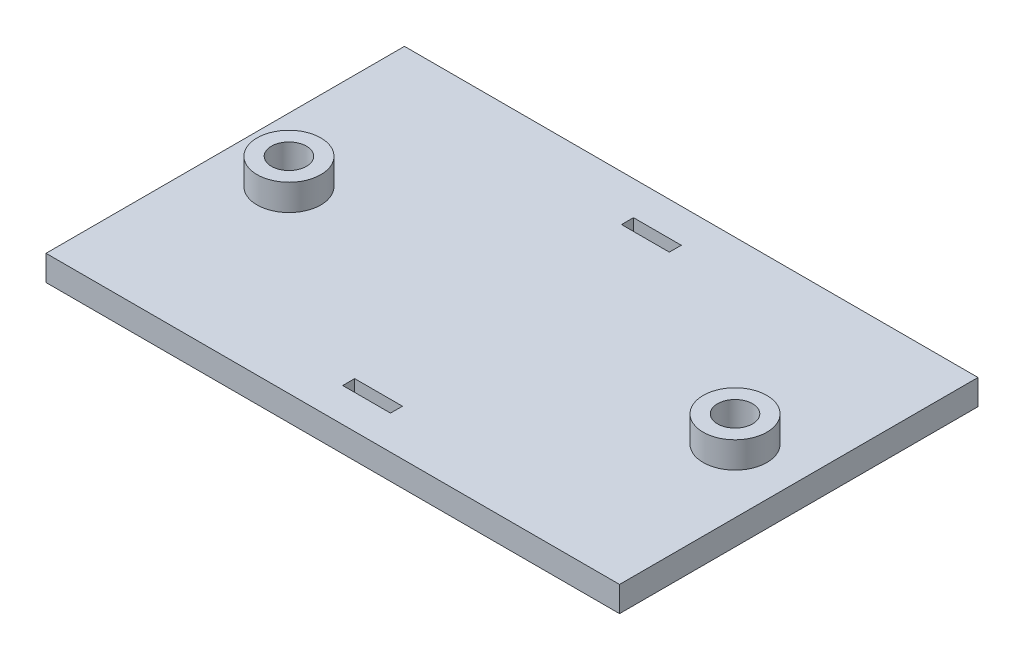
ISO-10303-21;
HEADER;
FILE_DESCRIPTION(('STEP AP214'),'2;1');
FILE_NAME('part.step','',(''),(''),'','','');
FILE_SCHEMA(('AUTOMOTIVE_DESIGN { 1 0 10303 214 1 1 1 1 }'));
ENDSEC;
DATA;
#1=APPLICATION_CONTEXT('core data for automotive mechanical design processes');
#2=APPLICATION_PROTOCOL_DEFINITION('international standard','automotive_design',2000,#1);
#3=PRODUCT_CONTEXT('',#1,'mechanical');
#4=PRODUCT('Part','Part','',(#3));
#5=PRODUCT_RELATED_PRODUCT_CATEGORY('part','',(#4));
#6=PRODUCT_DEFINITION_FORMATION('','',#4);
#7=PRODUCT_DEFINITION_CONTEXT('part definition',#1,'design');
#8=PRODUCT_DEFINITION('design','',#6,#7);
#9=PRODUCT_DEFINITION_SHAPE('','',#8);
#10=(LENGTH_UNIT() NAMED_UNIT(*) SI_UNIT(.MILLI.,.METRE.));
#11=(NAMED_UNIT(*) PLANE_ANGLE_UNIT() SI_UNIT($,.RADIAN.));
#12=(NAMED_UNIT(*) SI_UNIT($,.STERADIAN.) SOLID_ANGLE_UNIT());
#13=UNCERTAINTY_MEASURE_WITH_UNIT(LENGTH_MEASURE(1.E-05),#10,'distance_accuracy_value','');
#14=(GEOMETRIC_REPRESENTATION_CONTEXT(3) GLOBAL_UNCERTAINTY_ASSIGNED_CONTEXT((#13)) GLOBAL_UNIT_ASSIGNED_CONTEXT((#10,
#11,#12)) REPRESENTATION_CONTEXT('',''));
#15=CARTESIAN_POINT('',(0.,0.,0.));
#16=DIRECTION('',(0.,0.,1.));
#17=DIRECTION('',(1.,0.,0.));
#18=AXIS2_PLACEMENT_3D('',#15,#16,#17);
#19=CARTESIAN_POINT('',(0.,95.75,0.));
#20=DIRECTION('',(0.,-1.,0.));
#21=DIRECTION('',(0.,0.,-1.));
#22=AXIS2_PLACEMENT_3D('',#19,#20,#21);
#23=PLANE('',#22);
#24=CARTESIAN_POINT('',(-28.,95.75,0.));
#25=DIRECTION('',(0.,1.,0.));
#26=DIRECTION('',(0.,0.,1.));
#27=AXIS2_PLACEMENT_3D('',#24,#25,#26);
#28=CIRCLE('',#27,4.);
#29=CARTESIAN_POINT('',(-28.,95.75,-4.));
#30=VERTEX_POINT('',#29);
#31=EDGE_CURVE('E11',#30,#30,#28,.T.);
#32=ORIENTED_EDGE('',*,*,#31,.F.);
#33=EDGE_LOOP('',(#32));
#34=FACE_BOUND('',#33,.T.);
#35=CARTESIAN_POINT('',(28.,95.75,0.));
#36=DIRECTION('',(0.,1.,0.));
#37=DIRECTION('',(0.,0.,1.));
#38=AXIS2_PLACEMENT_3D('',#35,#36,#37);
#39=CIRCLE('',#38,4.);
#40=CARTESIAN_POINT('',(28.,95.75,-4.));
#41=VERTEX_POINT('',#40);
#42=EDGE_CURVE('E49',#41,#41,#39,.T.);
#43=ORIENTED_EDGE('',*,*,#42,.F.);
#44=EDGE_LOOP('',(#43));
#45=FACE_BOUND('',#44,.T.);
#46=DIRECTION('',(0.,0.,1.));
#47=VECTOR('',#46,1.);
#48=CARTESIAN_POINT('',(-3.,95.75,-16.75));
#49=LINE('',#48,#47);
#50=CARTESIAN_POINT('',(-3.,95.75,-18.25));
#51=VERTEX_POINT('',#50);
#52=CARTESIAN_POINT('',(-3.,95.75,-16.75));
#53=VERTEX_POINT('',#52);
#54=EDGE_CURVE('E168',#51,#53,#49,.T.);
#55=ORIENTED_EDGE('',*,*,#54,.F.);
#56=DIRECTION('',(-1.,0.,0.));
#57=VECTOR('',#56,1.);
#58=CARTESIAN_POINT('',(-3.,95.75,-18.25));
#59=LINE('',#58,#57);
#60=CARTESIAN_POINT('',(3.,95.75,-18.25));
#61=VERTEX_POINT('',#60);
#62=EDGE_CURVE('E179',#61,#51,#59,.T.);
#63=ORIENTED_EDGE('',*,*,#62,.F.);
#64=DIRECTION('',(0.,0.,-1.));
#65=VECTOR('',#64,1.);
#66=CARTESIAN_POINT('',(3.,95.75,-18.25));
#67=LINE('',#66,#65);
#68=CARTESIAN_POINT('',(3.,95.75,-16.75));
#69=VERTEX_POINT('',#68);
#70=EDGE_CURVE('E172',#69,#61,#67,.T.);
#71=ORIENTED_EDGE('',*,*,#70,.F.);
#72=DIRECTION('',(1.,0.,0.));
#73=VECTOR('',#72,1.);
#74=CARTESIAN_POINT('',(3.,95.75,-16.75));
#75=LINE('',#74,#73);
#76=EDGE_CURVE('E171',#53,#69,#75,.T.);
#77=ORIENTED_EDGE('',*,*,#76,.F.);
#78=EDGE_LOOP('',(#55,#63,#71,#77));
#79=FACE_BOUND('',#78,.T.);
#80=DIRECTION('',(0.,0.,1.));
#81=VECTOR('',#80,1.);
#82=CARTESIAN_POINT('',(-36.,95.75,22.5));
#83=LINE('',#82,#81);
#84=CARTESIAN_POINT('',(-36.,95.75,-22.5));
#85=VERTEX_POINT('',#84);
#86=CARTESIAN_POINT('',(-36.,95.75,22.5));
#87=VERTEX_POINT('',#86);
#88=EDGE_CURVE('E203',#85,#87,#83,.T.);
#89=ORIENTED_EDGE('',*,*,#88,.T.);
#90=DIRECTION('',(1.,0.,0.));
#91=VECTOR('',#90,1.);
#92=CARTESIAN_POINT('',(36.,95.75,22.5));
#93=LINE('',#92,#91);
#94=CARTESIAN_POINT('',(36.,95.75,22.5));
#95=VERTEX_POINT('',#94);
#96=EDGE_CURVE('E204',#87,#95,#93,.T.);
#97=ORIENTED_EDGE('',*,*,#96,.T.);
#98=DIRECTION('',(0.,0.,-1.));
#99=VECTOR('',#98,1.);
#100=CARTESIAN_POINT('',(36.,95.75,-22.5));
#101=LINE('',#100,#99);
#102=CARTESIAN_POINT('',(36.,95.75,-22.5));
#103=VERTEX_POINT('',#102);
#104=EDGE_CURVE('E210',#95,#103,#101,.T.);
#105=ORIENTED_EDGE('',*,*,#104,.T.);
#106=DIRECTION('',(-1.,0.,0.));
#107=VECTOR('',#106,1.);
#108=CARTESIAN_POINT('',(-36.,95.75,-22.5));
#109=LINE('',#108,#107);
#110=EDGE_CURVE('E207',#103,#85,#109,.T.);
#111=ORIENTED_EDGE('',*,*,#110,.T.);
#112=EDGE_LOOP('',(#89,#97,#105,#111));
#113=FACE_BOUND('',#112,.T.);
#114=DIRECTION('',(0.,0.,1.));
#115=VECTOR('',#114,1.);
#116=CARTESIAN_POINT('',(-3.,95.75,18.25));
#117=LINE('',#116,#115);
#118=CARTESIAN_POINT('',(-3.,95.75,16.75));
#119=VERTEX_POINT('',#118);
#120=CARTESIAN_POINT('',(-3.,95.75,18.25));
#121=VERTEX_POINT('',#120);
#122=EDGE_CURVE('E131',#119,#121,#117,.T.);
#123=ORIENTED_EDGE('',*,*,#122,.F.);
#124=DIRECTION('',(-1.,0.,0.));
#125=VECTOR('',#124,1.);
#126=CARTESIAN_POINT('',(-3.,95.75,16.75));
#127=LINE('',#126,#125);
#128=CARTESIAN_POINT('',(3.,95.75,16.75));
#129=VERTEX_POINT('',#128);
#130=EDGE_CURVE('E152',#129,#119,#127,.T.);
#131=ORIENTED_EDGE('',*,*,#130,.F.);
#132=DIRECTION('',(0.,0.,-1.));
#133=VECTOR('',#132,1.);
#134=CARTESIAN_POINT('',(3.,95.75,16.75));
#135=LINE('',#134,#133);
#136=CARTESIAN_POINT('',(3.,95.75,18.25));
#137=VERTEX_POINT('',#136);
#138=EDGE_CURVE('E155',#137,#129,#135,.T.);
#139=ORIENTED_EDGE('',*,*,#138,.F.);
#140=DIRECTION('',(1.,0.,0.));
#141=VECTOR('',#140,1.);
#142=CARTESIAN_POINT('',(3.,95.75,18.25));
#143=LINE('',#142,#141);
#144=EDGE_CURVE('E140',#121,#137,#143,.T.);
#145=ORIENTED_EDGE('',*,*,#144,.F.);
#146=EDGE_LOOP('',(#123,#131,#139,#145));
#147=FACE_BOUND('',#146,.T.);
#148=ADVANCED_FACE('F41',(#34,#45,#79,#113,#147),#23,.F.);
#149=CARTESIAN_POINT('',(0.,92.57,0.));
#150=DIRECTION('',(0.,-1.,0.));
#151=DIRECTION('',(0.,0.,-1.));
#152=AXIS2_PLACEMENT_3D('',#149,#150,#151);
#153=PLANE('',#152);
#154=CARTESIAN_POINT('',(-28.,92.57,0.));
#155=DIRECTION('',(0.,1.,0.));
#156=DIRECTION('',(0.,0.,1.));
#157=AXIS2_PLACEMENT_3D('',#154,#155,#156);
#158=CIRCLE('',#157,2.2);
#159=CARTESIAN_POINT('',(-28.,92.57,2.2));
#160=VERTEX_POINT('',#159);
#161=EDGE_CURVE('E159',#160,#160,#158,.T.);
#162=ORIENTED_EDGE('',*,*,#161,.T.);
#163=EDGE_LOOP('',(#162));
#164=FACE_BOUND('',#163,.T.);
#165=DIRECTION('',(0.,0.,1.));
#166=VECTOR('',#165,1.);
#167=CARTESIAN_POINT('',(-36.,92.57,22.5));
#168=LINE('',#167,#166);
#169=CARTESIAN_POINT('',(-36.,92.57,-22.5));
#170=VERTEX_POINT('',#169);
#171=CARTESIAN_POINT('',(-36.,92.57,22.5));
#172=VERTEX_POINT('',#171);
#173=EDGE_CURVE('E199',#170,#172,#168,.T.);
#174=ORIENTED_EDGE('',*,*,#173,.F.);
#175=DIRECTION('',(-1.,0.,0.));
#176=VECTOR('',#175,1.);
#177=CARTESIAN_POINT('',(-36.,92.57,-22.5));
#178=LINE('',#177,#176);
#179=CARTESIAN_POINT('',(36.,92.57,-22.5));
#180=VERTEX_POINT('',#179);
#181=EDGE_CURVE('E202',#180,#170,#178,.T.);
#182=ORIENTED_EDGE('',*,*,#181,.F.);
#183=DIRECTION('',(0.,0.,-1.));
#184=VECTOR('',#183,1.);
#185=CARTESIAN_POINT('',(36.,92.57,-22.5));
#186=LINE('',#185,#184);
#187=CARTESIAN_POINT('',(36.,92.57,22.5));
#188=VERTEX_POINT('',#187);
#189=EDGE_CURVE('E216',#188,#180,#186,.T.);
#190=ORIENTED_EDGE('',*,*,#189,.F.);
#191=DIRECTION('',(1.,0.,0.));
#192=VECTOR('',#191,1.);
#193=CARTESIAN_POINT('',(36.,92.57,22.5));
#194=LINE('',#193,#192);
#195=EDGE_CURVE('E212',#172,#188,#194,.T.);
#196=ORIENTED_EDGE('',*,*,#195,.F.);
#197=EDGE_LOOP('',(#174,#182,#190,#196));
#198=FACE_BOUND('',#197,.T.);
#199=DIRECTION('',(-1.,0.,0.));
#200=VECTOR('',#199,1.);
#201=CARTESIAN_POINT('',(-3.,92.57,-18.25));
#202=LINE('',#201,#200);
#203=CARTESIAN_POINT('',(3.,92.57,-18.25));
#204=VERTEX_POINT('',#203);
#205=CARTESIAN_POINT('',(-3.,92.57,-18.25));
#206=VERTEX_POINT('',#205);
#207=EDGE_CURVE('E175',#204,#206,#202,.T.);
#208=ORIENTED_EDGE('',*,*,#207,.T.);
#209=DIRECTION('',(0.,0.,1.));
#210=VECTOR('',#209,1.);
#211=CARTESIAN_POINT('',(-3.,92.57,-16.75));
#212=LINE('',#211,#210);
#213=CARTESIAN_POINT('',(-3.,92.57,-16.75));
#214=VERTEX_POINT('',#213);
#215=EDGE_CURVE('E146',#206,#214,#212,.T.);
#216=ORIENTED_EDGE('',*,*,#215,.T.);
#217=DIRECTION('',(1.,0.,0.));
#218=VECTOR('',#217,1.);
#219=CARTESIAN_POINT('',(3.,92.57,-16.75));
#220=LINE('',#219,#218);
#221=CARTESIAN_POINT('',(3.,92.57,-16.75));
#222=VERTEX_POINT('',#221);
#223=EDGE_CURVE('E181',#214,#222,#220,.T.);
#224=ORIENTED_EDGE('',*,*,#223,.T.);
#225=DIRECTION('',(0.,0.,-1.));
#226=VECTOR('',#225,1.);
#227=CARTESIAN_POINT('',(3.,92.57,-18.25));
#228=LINE('',#227,#226);
#229=EDGE_CURVE('E189',#222,#204,#228,.T.);
#230=ORIENTED_EDGE('',*,*,#229,.T.);
#231=EDGE_LOOP('',(#208,#216,#224,#230));
#232=FACE_BOUND('',#231,.T.);
#233=DIRECTION('',(-1.,0.,0.));
#234=VECTOR('',#233,1.);
#235=CARTESIAN_POINT('',(-3.,92.57,16.75));
#236=LINE('',#235,#234);
#237=CARTESIAN_POINT('',(3.,92.57,16.75));
#238=VERTEX_POINT('',#237);
#239=CARTESIAN_POINT('',(-3.,92.57,16.75));
#240=VERTEX_POINT('',#239);
#241=EDGE_CURVE('E143',#238,#240,#236,.T.);
#242=ORIENTED_EDGE('',*,*,#241,.T.);
#243=DIRECTION('',(0.,0.,1.));
#244=VECTOR('',#243,1.);
#245=CARTESIAN_POINT('',(-3.,92.57,18.25));
#246=LINE('',#245,#244);
#247=CARTESIAN_POINT('',(-3.,92.57,18.25));
#248=VERTEX_POINT('',#247);
#249=EDGE_CURVE('E66',#240,#248,#246,.T.);
#250=ORIENTED_EDGE('',*,*,#249,.T.);
#251=DIRECTION('',(1.,0.,0.));
#252=VECTOR('',#251,1.);
#253=CARTESIAN_POINT('',(3.,92.57,18.25));
#254=LINE('',#253,#252);
#255=CARTESIAN_POINT('',(3.,92.57,18.25));
#256=VERTEX_POINT('',#255);
#257=EDGE_CURVE('E150',#248,#256,#254,.T.);
#258=ORIENTED_EDGE('',*,*,#257,.T.);
#259=DIRECTION('',(0.,0.,-1.));
#260=VECTOR('',#259,1.);
#261=CARTESIAN_POINT('',(3.,92.57,16.75));
#262=LINE('',#261,#260);
#263=EDGE_CURVE('E165',#256,#238,#262,.T.);
#264=ORIENTED_EDGE('',*,*,#263,.T.);
#265=EDGE_LOOP('',(#242,#250,#258,#264));
#266=FACE_BOUND('',#265,.T.);
#267=CARTESIAN_POINT('',(28.,92.57,0.));
#268=DIRECTION('',(0.,1.,0.));
#269=DIRECTION('',(0.,0.,1.));
#270=AXIS2_PLACEMENT_3D('',#267,#268,#269);
#271=CIRCLE('',#270,2.2);
#272=CARTESIAN_POINT('',(28.,92.57,2.2));
#273=VERTEX_POINT('',#272);
#274=EDGE_CURVE('E242',#273,#273,#271,.T.);
#275=ORIENTED_EDGE('',*,*,#274,.T.);
#276=EDGE_LOOP('',(#275));
#277=FACE_BOUND('',#276,.T.);
#278=ADVANCED_FACE('F253',(#164,#198,#232,#266,#277),#153,.T.);
#279=CARTESIAN_POINT('',(-36.,95.75,22.5));
#280=DIRECTION('',(1.,0.,0.));
#281=DIRECTION('',(0.,0.,-1.));
#282=AXIS2_PLACEMENT_3D('',#279,#280,#281);
#283=PLANE('',#282);
#284=ORIENTED_EDGE('',*,*,#173,.T.);
#285=DIRECTION('',(0.,-1.,0.));
#286=VECTOR('',#285,1.);
#287=CARTESIAN_POINT('',(-36.,95.75,22.5));
#288=LINE('',#287,#286);
#289=EDGE_CURVE('E44',#87,#172,#288,.T.);
#290=ORIENTED_EDGE('',*,*,#289,.F.);
#291=ORIENTED_EDGE('',*,*,#88,.F.);
#292=DIRECTION('',(0.,-1.,0.));
#293=VECTOR('',#292,1.);
#294=CARTESIAN_POINT('',(-36.,95.75,-22.5));
#295=LINE('',#294,#293);
#296=EDGE_CURVE('E211',#85,#170,#295,.T.);
#297=ORIENTED_EDGE('',*,*,#296,.T.);
#298=EDGE_LOOP('',(#284,#290,#291,#297));
#299=FACE_BOUND('',#298,.T.);
#300=ADVANCED_FACE('F43',(#299),#283,.F.);
#301=CARTESIAN_POINT('',(36.,95.75,22.5));
#302=DIRECTION('',(0.,0.,-1.));
#303=DIRECTION('',(-1.,0.,0.));
#304=AXIS2_PLACEMENT_3D('',#301,#302,#303);
#305=PLANE('',#304);
#306=ORIENTED_EDGE('',*,*,#195,.T.);
#307=DIRECTION('',(0.,-1.,0.));
#308=VECTOR('',#307,1.);
#309=CARTESIAN_POINT('',(36.,95.75,22.5));
#310=LINE('',#309,#308);
#311=EDGE_CURVE('E224',#95,#188,#310,.T.);
#312=ORIENTED_EDGE('',*,*,#311,.F.);
#313=ORIENTED_EDGE('',*,*,#96,.F.);
#314=ORIENTED_EDGE('',*,*,#289,.T.);
#315=EDGE_LOOP('',(#306,#312,#313,#314));
#316=FACE_BOUND('',#315,.T.);
#317=ADVANCED_FACE('F290',(#316),#305,.F.);
#318=CARTESIAN_POINT('',(36.,95.75,-22.5));
#319=DIRECTION('',(-1.,0.,0.));
#320=DIRECTION('',(0.,0.,1.));
#321=AXIS2_PLACEMENT_3D('',#318,#319,#320);
#322=PLANE('',#321);
#323=ORIENTED_EDGE('',*,*,#189,.T.);
#324=DIRECTION('',(0.,-1.,0.));
#325=VECTOR('',#324,1.);
#326=CARTESIAN_POINT('',(36.,95.75,-22.5));
#327=LINE('',#326,#325);
#328=EDGE_CURVE('E222',#103,#180,#327,.T.);
#329=ORIENTED_EDGE('',*,*,#328,.F.);
#330=ORIENTED_EDGE('',*,*,#104,.F.);
#331=ORIENTED_EDGE('',*,*,#311,.T.);
#332=EDGE_LOOP('',(#323,#329,#330,#331));
#333=FACE_BOUND('',#332,.T.);
#334=ADVANCED_FACE('F295',(#333),#322,.F.);
#335=CARTESIAN_POINT('',(-36.,95.75,-22.5));
#336=DIRECTION('',(0.,0.,1.));
#337=DIRECTION('',(1.,0.,0.));
#338=AXIS2_PLACEMENT_3D('',#335,#336,#337);
#339=PLANE('',#338);
#340=ORIENTED_EDGE('',*,*,#181,.T.);
#341=ORIENTED_EDGE('',*,*,#296,.F.);
#342=ORIENTED_EDGE('',*,*,#110,.F.);
#343=ORIENTED_EDGE('',*,*,#328,.T.);
#344=EDGE_LOOP('',(#340,#341,#342,#343));
#345=FACE_BOUND('',#344,.T.);
#346=ADVANCED_FACE('F294',(#345),#339,.F.);
#347=CARTESIAN_POINT('',(-3.,95.75,-16.75));
#348=DIRECTION('',(1.,0.,0.));
#349=DIRECTION('',(0.,0.,-1.));
#350=AXIS2_PLACEMENT_3D('',#347,#348,#349);
#351=PLANE('',#350);
#352=ORIENTED_EDGE('',*,*,#215,.F.);
#353=DIRECTION('',(0.,-1.,0.));
#354=VECTOR('',#353,1.);
#355=CARTESIAN_POINT('',(-3.,95.75,-18.25));
#356=LINE('',#355,#354);
#357=EDGE_CURVE('E180',#51,#206,#356,.T.);
#358=ORIENTED_EDGE('',*,*,#357,.F.);
#359=ORIENTED_EDGE('',*,*,#54,.T.);
#360=DIRECTION('',(0.,-1.,0.));
#361=VECTOR('',#360,1.);
#362=CARTESIAN_POINT('',(-3.,95.75,-16.75));
#363=LINE('',#362,#361);
#364=EDGE_CURVE('E197',#53,#214,#363,.T.);
#365=ORIENTED_EDGE('',*,*,#364,.T.);
#366=EDGE_LOOP('',(#352,#358,#359,#365));
#367=FACE_BOUND('',#366,.T.);
#368=ADVANCED_FACE('F299',(#367),#351,.T.);
#369=CARTESIAN_POINT('',(3.,95.75,-16.75));
#370=DIRECTION('',(0.,0.,-1.));
#371=DIRECTION('',(-1.,0.,0.));
#372=AXIS2_PLACEMENT_3D('',#369,#370,#371);
#373=PLANE('',#372);
#374=ORIENTED_EDGE('',*,*,#223,.F.);
#375=ORIENTED_EDGE('',*,*,#364,.F.);
#376=ORIENTED_EDGE('',*,*,#76,.T.);
#377=DIRECTION('',(0.,-1.,0.));
#378=VECTOR('',#377,1.);
#379=CARTESIAN_POINT('',(3.,95.75,-16.75));
#380=LINE('',#379,#378);
#381=EDGE_CURVE('E195',#69,#222,#380,.T.);
#382=ORIENTED_EDGE('',*,*,#381,.T.);
#383=EDGE_LOOP('',(#374,#375,#376,#382));
#384=FACE_BOUND('',#383,.T.);
#385=ADVANCED_FACE('F302',(#384),#373,.T.);
#386=CARTESIAN_POINT('',(3.,95.75,-18.25));
#387=DIRECTION('',(-1.,0.,0.));
#388=DIRECTION('',(0.,0.,1.));
#389=AXIS2_PLACEMENT_3D('',#386,#387,#388);
#390=PLANE('',#389);
#391=ORIENTED_EDGE('',*,*,#229,.F.);
#392=ORIENTED_EDGE('',*,*,#381,.F.);
#393=ORIENTED_EDGE('',*,*,#70,.T.);
#394=DIRECTION('',(0.,-1.,0.));
#395=VECTOR('',#394,1.);
#396=CARTESIAN_POINT('',(3.,95.75,-18.25));
#397=LINE('',#396,#395);
#398=EDGE_CURVE('E194',#61,#204,#397,.T.);
#399=ORIENTED_EDGE('',*,*,#398,.T.);
#400=EDGE_LOOP('',(#391,#392,#393,#399));
#401=FACE_BOUND('',#400,.T.);
#402=ADVANCED_FACE('F353',(#401),#390,.T.);
#403=CARTESIAN_POINT('',(-3.,95.75,-18.25));
#404=DIRECTION('',(0.,0.,1.));
#405=DIRECTION('',(1.,0.,0.));
#406=AXIS2_PLACEMENT_3D('',#403,#404,#405);
#407=PLANE('',#406);
#408=ORIENTED_EDGE('',*,*,#207,.F.);
#409=ORIENTED_EDGE('',*,*,#398,.F.);
#410=ORIENTED_EDGE('',*,*,#62,.T.);
#411=ORIENTED_EDGE('',*,*,#357,.T.);
#412=EDGE_LOOP('',(#408,#409,#410,#411));
#413=FACE_BOUND('',#412,.T.);
#414=ADVANCED_FACE('F365',(#413),#407,.T.);
#415=CARTESIAN_POINT('',(-3.,95.75,18.25));
#416=DIRECTION('',(1.,0.,0.));
#417=DIRECTION('',(0.,0.,-1.));
#418=AXIS2_PLACEMENT_3D('',#415,#416,#417);
#419=PLANE('',#418);
#420=ORIENTED_EDGE('',*,*,#249,.F.);
#421=DIRECTION('',(0.,-1.,0.));
#422=VECTOR('',#421,1.);
#423=CARTESIAN_POINT('',(-3.,95.75,16.75));
#424=LINE('',#423,#422);
#425=EDGE_CURVE('E136',#119,#240,#424,.T.);
#426=ORIENTED_EDGE('',*,*,#425,.F.);
#427=ORIENTED_EDGE('',*,*,#122,.T.);
#428=DIRECTION('',(0.,-1.,0.));
#429=VECTOR('',#428,1.);
#430=CARTESIAN_POINT('',(-3.,95.75,18.25));
#431=LINE('',#430,#429);
#432=EDGE_CURVE('E132',#121,#248,#431,.T.);
#433=ORIENTED_EDGE('',*,*,#432,.T.);
#434=EDGE_LOOP('',(#420,#426,#427,#433));
#435=FACE_BOUND('',#434,.T.);
#436=ADVANCED_FACE('F133',(#435),#419,.T.);
#437=CARTESIAN_POINT('',(3.,95.75,18.25));
#438=DIRECTION('',(0.,0.,-1.));
#439=DIRECTION('',(-1.,0.,0.));
#440=AXIS2_PLACEMENT_3D('',#437,#438,#439);
#441=PLANE('',#440);
#442=ORIENTED_EDGE('',*,*,#257,.F.);
#443=ORIENTED_EDGE('',*,*,#432,.F.);
#444=ORIENTED_EDGE('',*,*,#144,.T.);
#445=DIRECTION('',(0.,-1.,0.));
#446=VECTOR('',#445,1.);
#447=CARTESIAN_POINT('',(3.,95.75,18.25));
#448=LINE('',#447,#446);
#449=EDGE_CURVE('E149',#137,#256,#448,.T.);
#450=ORIENTED_EDGE('',*,*,#449,.T.);
#451=EDGE_LOOP('',(#442,#443,#444,#450));
#452=FACE_BOUND('',#451,.T.);
#453=ADVANCED_FACE('F145',(#452),#441,.T.);
#454=CARTESIAN_POINT('',(3.,95.75,16.75));
#455=DIRECTION('',(-1.,0.,0.));
#456=DIRECTION('',(0.,0.,1.));
#457=AXIS2_PLACEMENT_3D('',#454,#455,#456);
#458=PLANE('',#457);
#459=ORIENTED_EDGE('',*,*,#263,.F.);
#460=ORIENTED_EDGE('',*,*,#449,.F.);
#461=ORIENTED_EDGE('',*,*,#138,.T.);
#462=DIRECTION('',(0.,-1.,0.));
#463=VECTOR('',#462,1.);
#464=CARTESIAN_POINT('',(3.,95.75,16.75));
#465=LINE('',#464,#463);
#466=EDGE_CURVE('E59',#129,#238,#465,.T.);
#467=ORIENTED_EDGE('',*,*,#466,.T.);
#468=EDGE_LOOP('',(#459,#460,#461,#467));
#469=FACE_BOUND('',#468,.T.);
#470=ADVANCED_FACE('F394',(#469),#458,.T.);
#471=CARTESIAN_POINT('',(-3.,95.75,16.75));
#472=DIRECTION('',(0.,0.,1.));
#473=DIRECTION('',(1.,0.,0.));
#474=AXIS2_PLACEMENT_3D('',#471,#472,#473);
#475=PLANE('',#474);
#476=ORIENTED_EDGE('',*,*,#241,.F.);
#477=ORIENTED_EDGE('',*,*,#466,.F.);
#478=ORIENTED_EDGE('',*,*,#130,.T.);
#479=ORIENTED_EDGE('',*,*,#425,.T.);
#480=EDGE_LOOP('',(#476,#477,#478,#479));
#481=FACE_BOUND('',#480,.T.);
#482=ADVANCED_FACE('F256',(#481),#475,.T.);
#483=CARTESIAN_POINT('',(-28.,95.75,0.));
#484=DIRECTION('',(0.,-1.,0.));
#485=DIRECTION('',(0.,0.,-1.));
#486=AXIS2_PLACEMENT_3D('',#483,#484,#485);
#487=CYLINDRICAL_SURFACE('',#486,2.2);
#488=ORIENTED_EDGE('',*,*,#161,.F.);
#489=EDGE_LOOP('',(#488));
#490=FACE_BOUND('',#489,.T.);
#491=CARTESIAN_POINT('',(-28.,99.05,0.));
#492=DIRECTION('',(0.,1.,0.));
#493=DIRECTION('',(0.,0.,1.));
#494=AXIS2_PLACEMENT_3D('',#491,#492,#493);
#495=CIRCLE('',#494,2.2);
#496=CARTESIAN_POINT('',(-28.,99.05,2.2));
#497=VERTEX_POINT('',#496);
#498=EDGE_CURVE('E243',#497,#497,#495,.T.);
#499=ORIENTED_EDGE('',*,*,#498,.T.);
#500=EDGE_LOOP('',(#499));
#501=FACE_BOUND('',#500,.T.);
#502=ADVANCED_FACE('F255',(#490,#501),#487,.F.);
#503=CARTESIAN_POINT('',(28.,95.75,0.));
#504=DIRECTION('',(0.,-1.,0.));
#505=DIRECTION('',(0.,0.,-1.));
#506=AXIS2_PLACEMENT_3D('',#503,#504,#505);
#507=CYLINDRICAL_SURFACE('',#506,2.2);
#508=ORIENTED_EDGE('',*,*,#274,.F.);
#509=EDGE_LOOP('',(#508));
#510=FACE_BOUND('',#509,.T.);
#511=CARTESIAN_POINT('',(28.,99.05,0.));
#512=DIRECTION('',(0.,1.,0.));
#513=DIRECTION('',(0.,0.,1.));
#514=AXIS2_PLACEMENT_3D('',#511,#512,#513);
#515=CIRCLE('',#514,2.2);
#516=CARTESIAN_POINT('',(28.,99.05,2.2));
#517=VERTEX_POINT('',#516);
#518=EDGE_CURVE('E244',#517,#517,#515,.T.);
#519=ORIENTED_EDGE('',*,*,#518,.T.);
#520=EDGE_LOOP('',(#519));
#521=FACE_BOUND('',#520,.T.);
#522=ADVANCED_FACE('F260',(#510,#521),#507,.F.);
#523=CARTESIAN_POINT('',(28.,99.05,0.));
#524=DIRECTION('',(0.,1.,0.));
#525=DIRECTION('',(0.,0.,1.));
#526=AXIS2_PLACEMENT_3D('',#523,#524,#525);
#527=PLANE('',#526);
#528=CARTESIAN_POINT('',(28.,99.05,0.));
#529=DIRECTION('',(0.,1.,0.));
#530=DIRECTION('',(0.,0.,1.));
#531=AXIS2_PLACEMENT_3D('',#528,#529,#530);
#532=CIRCLE('',#531,4.);
#533=CARTESIAN_POINT('',(28.,99.05,-4.));
#534=VERTEX_POINT('',#533);
#535=EDGE_CURVE('E236',#534,#534,#532,.T.);
#536=ORIENTED_EDGE('',*,*,#535,.T.);
#537=EDGE_LOOP('',(#536));
#538=FACE_BOUND('',#537,.T.);
#539=ORIENTED_EDGE('',*,*,#518,.F.);
#540=EDGE_LOOP('',(#539));
#541=FACE_BOUND('',#540,.T.);
#542=ADVANCED_FACE('F422',(#538,#541),#527,.T.);
#543=CARTESIAN_POINT('',(28.,99.05,0.));
#544=DIRECTION('',(0.,-1.,0.));
#545=DIRECTION('',(0.,0.,-1.));
#546=AXIS2_PLACEMENT_3D('',#543,#544,#545);
#547=CYLINDRICAL_SURFACE('',#546,4.);
#548=CARTESIAN_POINT('',(28.,99.05,-4.));
#549=CARTESIAN_POINT('',(28.,99.015625,-4.));
#550=CARTESIAN_POINT('',(28.,98.98125,-4.));
#551=CARTESIAN_POINT('',(28.,98.9125,-4.));
#552=CARTESIAN_POINT('',(28.,98.878125,-4.));
#553=CARTESIAN_POINT('',(28.,98.809375,-4.));
#554=CARTESIAN_POINT('',(28.,98.775,-4.));
#555=CARTESIAN_POINT('',(28.,98.70625,-4.));
#556=CARTESIAN_POINT('',(28.,98.671875,-4.));
#557=CARTESIAN_POINT('',(28.,98.603125,-4.));
#558=CARTESIAN_POINT('',(28.,98.56875,-4.));
#559=CARTESIAN_POINT('',(28.,98.5,-4.));
#560=CARTESIAN_POINT('',(28.,98.465625,-4.));
#561=CARTESIAN_POINT('',(28.,98.396875,-4.));
#562=CARTESIAN_POINT('',(28.,98.3625,-4.));
#563=CARTESIAN_POINT('',(28.,98.29375,-4.));
#564=CARTESIAN_POINT('',(28.,98.259375,-4.));
#565=CARTESIAN_POINT('',(28.,98.190625,-4.));
#566=CARTESIAN_POINT('',(28.,98.15625,-4.));
#567=CARTESIAN_POINT('',(28.,98.0875,-4.));
#568=CARTESIAN_POINT('',(28.,98.053125,-4.));
#569=CARTESIAN_POINT('',(28.,97.984375,-4.));
#570=CARTESIAN_POINT('',(28.,97.95,-4.));
#571=CARTESIAN_POINT('',(28.,97.88125,-4.));
#572=CARTESIAN_POINT('',(28.,97.846875,-4.));
#573=CARTESIAN_POINT('',(28.,97.778125,-4.));
#574=CARTESIAN_POINT('',(28.,97.74375,-4.));
#575=CARTESIAN_POINT('',(28.,97.675,-4.));
#576=CARTESIAN_POINT('',(28.,97.640625,-4.));
#577=CARTESIAN_POINT('',(28.,97.571875,-4.));
#578=CARTESIAN_POINT('',(28.,97.5375,-4.));
#579=CARTESIAN_POINT('',(28.,97.46875,-4.));
#580=CARTESIAN_POINT('',(28.,97.434375,-4.));
#581=CARTESIAN_POINT('',(28.,97.365625,-4.));
#582=CARTESIAN_POINT('',(28.,97.33125,-4.));
#583=CARTESIAN_POINT('',(28.,97.2625,-4.));
#584=CARTESIAN_POINT('',(28.,97.228125,-4.));
#585=CARTESIAN_POINT('',(28.,97.159375,-4.));
#586=CARTESIAN_POINT('',(28.,97.125,-4.));
#587=CARTESIAN_POINT('',(28.,97.05625,-4.));
#588=CARTESIAN_POINT('',(28.,97.021875,-4.));
#589=CARTESIAN_POINT('',(28.,96.953125,-4.));
#590=CARTESIAN_POINT('',(28.,96.91875,-4.));
#591=CARTESIAN_POINT('',(28.,96.85,-4.));
#592=CARTESIAN_POINT('',(28.,96.815625,-4.));
#593=CARTESIAN_POINT('',(28.,96.746875,-4.));
#594=CARTESIAN_POINT('',(28.,96.7125,-4.));
#595=CARTESIAN_POINT('',(28.,96.64375,-4.));
#596=CARTESIAN_POINT('',(28.,96.609375,-4.));
#597=CARTESIAN_POINT('',(28.,96.540625,-4.));
#598=CARTESIAN_POINT('',(28.,96.50625,-4.));
#599=CARTESIAN_POINT('',(28.,96.4375,-4.));
#600=CARTESIAN_POINT('',(28.,96.403125,-4.));
#601=CARTESIAN_POINT('',(28.,96.334375,-4.));
#602=CARTESIAN_POINT('',(28.,96.3,-4.));
#603=CARTESIAN_POINT('',(28.,96.23125,-4.));
#604=CARTESIAN_POINT('',(28.,96.196875,-4.));
#605=CARTESIAN_POINT('',(28.,96.128125,-4.));
#606=CARTESIAN_POINT('',(28.,96.09375,-4.));
#607=CARTESIAN_POINT('',(28.,96.025,-4.));
#608=CARTESIAN_POINT('',(28.,95.990625,-4.));
#609=CARTESIAN_POINT('',(28.,95.921875,-4.));
#610=CARTESIAN_POINT('',(28.,95.8875,-4.));
#611=CARTESIAN_POINT('',(28.,95.81875,-4.));
#612=CARTESIAN_POINT('',(28.,95.784375,-4.));
#613=CARTESIAN_POINT('',(28.,95.75,-4.));
#614=B_SPLINE_CURVE_WITH_KNOTS('',3,(#548,#549,#550,#551,#552,#553,#554,#555,#556,#557,#558,
#559,#560,#561,#562,#563,#564,#565,#566,#567,#568,#569,#570,#571,#572,#573,#574,#575,#576,#577,
#578,#579,#580,#581,#582,#583,#584,#585,#586,#587,#588,#589,#590,#591,#592,#593,#594,#595,#596,
#597,#598,#599,#600,#601,#602,#603,#604,#605,#606,#607,#608,#609,#610,#611,#612,#613),
.UNSPECIFIED.,.F.,.F.,(4,2,2,2,2,2,2,2,2,2,2,2,2,2,2,2,2,2,2,2,2,2,2,2,2,2,2,2,2,2,2,2,4),(0.,
0.103125000000009,0.206250000000005,0.309375000000001,0.41250000000001,0.515625000000006,
0.618750000000001,0.721875000000011,0.825000000000006,0.928125000000002,1.03125000000001,
1.13437500000001,1.2375,1.34062500000001,1.44375000000001,1.546875,1.65000000000001,
1.75312500000001,1.85625,1.959375,2.06250000000001,2.165625,2.26875,2.37187500000001,2.475,
2.578125,2.68125000000001,2.78437500000001,2.8875,2.99062500000001,3.09375000000001,3.196875,
3.30000000000001),.UNSPECIFIED.);
#615=EDGE_CURVE('BSEAM437',#534,#41,#614,.T.);
#616=ORIENTED_EDGE('',*,*,#535,.F.);
#617=ORIENTED_EDGE('',*,*,#42,.T.);
#618=ORIENTED_EDGE('',*,*,#615,.T.);
#619=ORIENTED_EDGE('',*,*,#615,.F.);
#620=EDGE_LOOP('',(#616,#618,#617,#619));
#621=FACE_BOUND('',#620,.T.);
#622=ADVANCED_FACE('F437',(#621),#547,.T.);
#623=CARTESIAN_POINT('',(-28.,99.05,0.));
#624=DIRECTION('',(0.,1.,0.));
#625=DIRECTION('',(0.,0.,1.));
#626=AXIS2_PLACEMENT_3D('',#623,#624,#625);
#627=PLANE('',#626);
#628=CARTESIAN_POINT('',(-28.,99.05,0.));
#629=DIRECTION('',(0.,1.,0.));
#630=DIRECTION('',(0.,0.,1.));
#631=AXIS2_PLACEMENT_3D('',#628,#629,#630);
#632=CIRCLE('',#631,4.);
#633=CARTESIAN_POINT('',(-28.,99.05,-4.));
#634=VERTEX_POINT('',#633);
#635=EDGE_CURVE('E247',#634,#634,#632,.T.);
#636=ORIENTED_EDGE('',*,*,#635,.T.);
#637=EDGE_LOOP('',(#636));
#638=FACE_BOUND('',#637,.T.);
#639=ORIENTED_EDGE('',*,*,#498,.F.);
#640=EDGE_LOOP('',(#639));
#641=FACE_BOUND('',#640,.T.);
#642=ADVANCED_FACE('F270',(#638,#641),#627,.T.);
#643=CARTESIAN_POINT('',(-28.,99.05,0.));
#644=DIRECTION('',(0.,-1.,0.));
#645=DIRECTION('',(0.,0.,-1.));
#646=AXIS2_PLACEMENT_3D('',#643,#644,#645);
#647=CYLINDRICAL_SURFACE('',#646,4.);
#648=CARTESIAN_POINT('',(-28.,99.05,-4.));
#649=CARTESIAN_POINT('',(-28.,99.015625,-4.));
#650=CARTESIAN_POINT('',(-28.,98.98125,-4.));
#651=CARTESIAN_POINT('',(-28.,98.9125,-4.));
#652=CARTESIAN_POINT('',(-28.,98.878125,-4.));
#653=CARTESIAN_POINT('',(-28.,98.809375,-4.));
#654=CARTESIAN_POINT('',(-28.,98.775,-4.));
#655=CARTESIAN_POINT('',(-28.,98.70625,-4.));
#656=CARTESIAN_POINT('',(-28.,98.671875,-4.));
#657=CARTESIAN_POINT('',(-28.,98.603125,-4.));
#658=CARTESIAN_POINT('',(-28.,98.56875,-4.));
#659=CARTESIAN_POINT('',(-28.,98.5,-4.));
#660=CARTESIAN_POINT('',(-28.,98.465625,-4.));
#661=CARTESIAN_POINT('',(-28.,98.396875,-4.));
#662=CARTESIAN_POINT('',(-28.,98.3625,-4.));
#663=CARTESIAN_POINT('',(-28.,98.29375,-4.));
#664=CARTESIAN_POINT('',(-28.,98.259375,-4.));
#665=CARTESIAN_POINT('',(-28.,98.190625,-4.));
#666=CARTESIAN_POINT('',(-28.,98.15625,-4.));
#667=CARTESIAN_POINT('',(-28.,98.0875,-4.));
#668=CARTESIAN_POINT('',(-28.,98.053125,-4.));
#669=CARTESIAN_POINT('',(-28.,97.984375,-4.));
#670=CARTESIAN_POINT('',(-28.,97.95,-4.));
#671=CARTESIAN_POINT('',(-28.,97.88125,-4.));
#672=CARTESIAN_POINT('',(-28.,97.846875,-4.));
#673=CARTESIAN_POINT('',(-28.,97.778125,-4.));
#674=CARTESIAN_POINT('',(-28.,97.74375,-4.));
#675=CARTESIAN_POINT('',(-28.,97.675,-4.));
#676=CARTESIAN_POINT('',(-28.,97.640625,-4.));
#677=CARTESIAN_POINT('',(-28.,97.571875,-4.));
#678=CARTESIAN_POINT('',(-28.,97.5375,-4.));
#679=CARTESIAN_POINT('',(-28.,97.46875,-4.));
#680=CARTESIAN_POINT('',(-28.,97.434375,-4.));
#681=CARTESIAN_POINT('',(-28.,97.365625,-4.));
#682=CARTESIAN_POINT('',(-28.,97.33125,-4.));
#683=CARTESIAN_POINT('',(-28.,97.2625,-4.));
#684=CARTESIAN_POINT('',(-28.,97.228125,-4.));
#685=CARTESIAN_POINT('',(-28.,97.159375,-4.));
#686=CARTESIAN_POINT('',(-28.,97.125,-4.));
#687=CARTESIAN_POINT('',(-28.,97.05625,-4.));
#688=CARTESIAN_POINT('',(-28.,97.021875,-4.));
#689=CARTESIAN_POINT('',(-28.,96.953125,-4.));
#690=CARTESIAN_POINT('',(-28.,96.91875,-4.));
#691=CARTESIAN_POINT('',(-28.,96.85,-4.));
#692=CARTESIAN_POINT('',(-28.,96.815625,-4.));
#693=CARTESIAN_POINT('',(-28.,96.746875,-4.));
#694=CARTESIAN_POINT('',(-28.,96.7125,-4.));
#695=CARTESIAN_POINT('',(-28.,96.64375,-4.));
#696=CARTESIAN_POINT('',(-28.,96.609375,-4.));
#697=CARTESIAN_POINT('',(-28.,96.540625,-4.));
#698=CARTESIAN_POINT('',(-28.,96.50625,-4.));
#699=CARTESIAN_POINT('',(-28.,96.4375,-4.));
#700=CARTESIAN_POINT('',(-28.,96.403125,-4.));
#701=CARTESIAN_POINT('',(-28.,96.334375,-4.));
#702=CARTESIAN_POINT('',(-28.,96.3,-4.));
#703=CARTESIAN_POINT('',(-28.,96.23125,-4.));
#704=CARTESIAN_POINT('',(-28.,96.196875,-4.));
#705=CARTESIAN_POINT('',(-28.,96.128125,-4.));
#706=CARTESIAN_POINT('',(-28.,96.09375,-4.));
#707=CARTESIAN_POINT('',(-28.,96.025,-4.));
#708=CARTESIAN_POINT('',(-28.,95.990625,-4.));
#709=CARTESIAN_POINT('',(-28.,95.921875,-4.));
#710=CARTESIAN_POINT('',(-28.,95.8875,-4.));
#711=CARTESIAN_POINT('',(-28.,95.81875,-4.));
#712=CARTESIAN_POINT('',(-28.,95.784375,-4.));
#713=CARTESIAN_POINT('',(-28.,95.75,-4.));
#714=B_SPLINE_CURVE_WITH_KNOTS('',3,(#648,#649,#650,#651,#652,#653,#654,#655,#656,#657,#658,
#659,#660,#661,#662,#663,#664,#665,#666,#667,#668,#669,#670,#671,#672,#673,#674,#675,#676,#677,
#678,#679,#680,#681,#682,#683,#684,#685,#686,#687,#688,#689,#690,#691,#692,#693,#694,#695,#696,
#697,#698,#699,#700,#701,#702,#703,#704,#705,#706,#707,#708,#709,#710,#711,#712,#713),
.UNSPECIFIED.,.F.,.F.,(4,2,2,2,2,2,2,2,2,2,2,2,2,2,2,2,2,2,2,2,2,2,2,2,2,2,2,2,2,2,2,2,4),(0.,
0.103125000000009,0.206250000000005,0.309375000000001,0.41250000000001,0.515625000000006,
0.618750000000001,0.721875000000011,0.825000000000006,0.928125000000002,1.03125000000001,
1.13437500000001,1.2375,1.34062500000001,1.44375000000001,1.546875,1.65000000000001,
1.75312500000001,1.85625,1.959375,2.06250000000001,2.165625,2.26875,2.37187500000001,2.475,
2.578125,2.68125000000001,2.78437500000001,2.8875,2.99062500000001,3.09375000000001,3.196875,
3.30000000000001),.UNSPECIFIED.);
#715=EDGE_CURVE('BSEAM267',#634,#30,#714,.T.);
#716=ORIENTED_EDGE('',*,*,#635,.F.);
#717=ORIENTED_EDGE('',*,*,#31,.T.);
#718=ORIENTED_EDGE('',*,*,#715,.T.);
#719=ORIENTED_EDGE('',*,*,#715,.F.);
#720=EDGE_LOOP('',(#716,#718,#717,#719));
#721=FACE_BOUND('',#720,.T.);
#722=ADVANCED_FACE('F267',(#721),#647,.T.);
#723=CLOSED_SHELL('',(#148,#278,#300,#317,#334,#346,#368,#385,#402,#414,#436,#453,#470,#482,
#502,#522,#542,#622,#642,#722));
#724=MANIFOLD_SOLID_BREP('B2',#723);
#725=ADVANCED_BREP_SHAPE_REPRESENTATION('',(#18,#724),#14);
#726=SHAPE_DEFINITION_REPRESENTATION(#9,#725);
ENDSEC;
END-ISO-10303-21;
